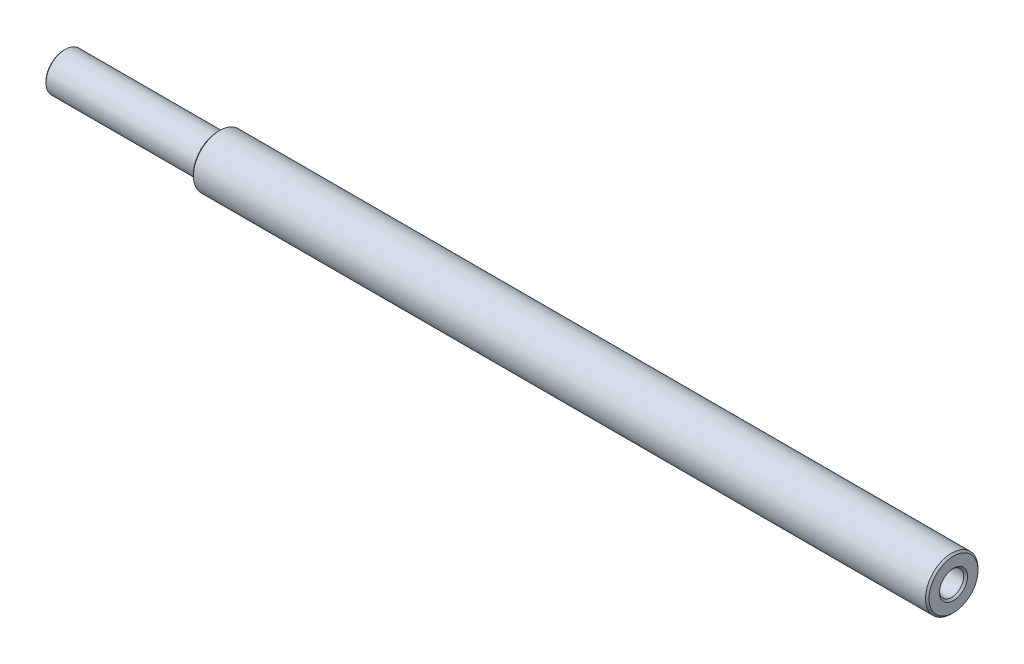
ISO-10303-21;
HEADER;
FILE_DESCRIPTION(('STEP AP214'),'2;1');
FILE_NAME('part.step','',(''),(''),'','','');
FILE_SCHEMA(('AUTOMOTIVE_DESIGN { 1 0 10303 214 1 1 1 1 }'));
ENDSEC;
DATA;
#1=APPLICATION_CONTEXT('core data for automotive mechanical design processes');
#2=APPLICATION_PROTOCOL_DEFINITION('international standard','automotive_design',2000,#1);
#3=PRODUCT_CONTEXT('',#1,'mechanical');
#4=PRODUCT('Part','Part','',(#3));
#5=PRODUCT_RELATED_PRODUCT_CATEGORY('part','',(#4));
#6=PRODUCT_DEFINITION_FORMATION('','',#4);
#7=PRODUCT_DEFINITION_CONTEXT('part definition',#1,'design');
#8=PRODUCT_DEFINITION('design','',#6,#7);
#9=PRODUCT_DEFINITION_SHAPE('','',#8);
#10=(LENGTH_UNIT() NAMED_UNIT(*) SI_UNIT(.MILLI.,.METRE.));
#11=(NAMED_UNIT(*) PLANE_ANGLE_UNIT() SI_UNIT($,.RADIAN.));
#12=(NAMED_UNIT(*) SI_UNIT($,.STERADIAN.) SOLID_ANGLE_UNIT());
#13=UNCERTAINTY_MEASURE_WITH_UNIT(LENGTH_MEASURE(1.E-05),#10,'distance_accuracy_value','');
#14=(GEOMETRIC_REPRESENTATION_CONTEXT(3) GLOBAL_UNCERTAINTY_ASSIGNED_CONTEXT((#13)) GLOBAL_UNIT_ASSIGNED_CONTEXT((#10,
#11,#12)) REPRESENTATION_CONTEXT('',''));
#15=CARTESIAN_POINT('',(0.,0.,0.));
#16=DIRECTION('',(0.,0.,1.));
#17=DIRECTION('',(1.,0.,0.));
#18=AXIS2_PLACEMENT_3D('',#15,#16,#17);
#19=CARTESIAN_POINT('',(-44.,-5.10000000000004,5.1000003918236));
#20=DIRECTION('',(-1.,0.,0.));
#21=DIRECTION('',(0.,1.,0.));
#22=AXIS2_PLACEMENT_3D('',#19,#20,#21);
#23=PLANE('',#22);
#24=CARTESIAN_POINT('',(-44.,0.,0.));
#25=DIRECTION('',(-1.,0.,0.));
#26=DIRECTION('',(0.,0.,-1.));
#27=AXIS2_PLACEMENT_3D('',#24,#25,#26);
#28=CIRCLE('',#27,5.1);
#29=CARTESIAN_POINT('',(-44.,0.,-5.1));
#30=VERTEX_POINT('',#29);
#31=EDGE_CURVE('E146',#30,#30,#28,.F.);
#32=ORIENTED_EDGE('',*,*,#31,.F.);
#33=EDGE_LOOP('',(#32));
#34=FACE_BOUND('',#33,.T.);
#35=CARTESIAN_POINT('',(-44.,0.,0.));
#36=DIRECTION('',(1.,0.,0.));
#37=DIRECTION('',(0.,0.,1.));
#38=AXIS2_PLACEMENT_3D('',#35,#36,#37);
#39=CIRCLE('',#38,3.);
#40=CARTESIAN_POINT('',(-44.,0.,3.));
#41=VERTEX_POINT('',#40);
#42=EDGE_CURVE('E143',#41,#41,#39,.T.);
#43=ORIENTED_EDGE('',*,*,#42,.T.);
#44=EDGE_LOOP('',(#43));
#45=FACE_BOUND('',#44,.T.);
#46=ADVANCED_FACE('F16',(#34,#45),#23,.T.);
#47=CARTESIAN_POINT('',(0.,-7.19126770361166,7.));
#48=DIRECTION('',(-1.,0.,0.));
#49=DIRECTION('',(0.,1.,0.));
#50=AXIS2_PLACEMENT_3D('',#47,#48,#49);
#51=PLANE('',#50);
#52=CARTESIAN_POINT('',(0.,0.,0.));
#53=DIRECTION('',(-1.,0.,0.));
#54=DIRECTION('',(0.,0.,-1.));
#55=AXIS2_PLACEMENT_3D('',#52,#53,#54);
#56=CIRCLE('',#55,7.);
#57=CARTESIAN_POINT('',(0.,0.,-7.));
#58=VERTEX_POINT('',#57);
#59=EDGE_CURVE('E140',#58,#58,#56,.F.);
#60=ORIENTED_EDGE('',*,*,#59,.F.);
#61=EDGE_LOOP('',(#60));
#62=FACE_BOUND('',#61,.T.);
#63=CARTESIAN_POINT('',(0.,0.,0.));
#64=DIRECTION('',(1.,0.,0.));
#65=DIRECTION('',(0.,0.,1.));
#66=AXIS2_PLACEMENT_3D('',#63,#64,#65);
#67=CIRCLE('',#66,5.8);
#68=CARTESIAN_POINT('',(0.,0.,5.8));
#69=VERTEX_POINT('',#68);
#70=EDGE_CURVE('E135',#69,#69,#67,.T.);
#71=ORIENTED_EDGE('',*,*,#70,.T.);
#72=EDGE_LOOP('',(#71));
#73=FACE_BOUND('',#72,.T.);
#74=ADVANCED_FACE('F49',(#62,#73),#51,.T.);
#75=CARTESIAN_POINT('',(210.,-7.19126770361165,-7.));
#76=DIRECTION('',(1.,0.,0.));
#77=DIRECTION('',(0.,1.,0.));
#78=AXIS2_PLACEMENT_3D('',#75,#76,#77);
#79=PLANE('',#78);
#80=CARTESIAN_POINT('',(210.,0.,0.));
#81=DIRECTION('',(1.,0.,0.));
#82=DIRECTION('',(0.,0.,1.));
#83=AXIS2_PLACEMENT_3D('',#80,#81,#82);
#84=CIRCLE('',#83,7.);
#85=CARTESIAN_POINT('',(210.,0.,7.));
#86=VERTEX_POINT('',#85);
#87=EDGE_CURVE('E131',#86,#86,#84,.T.);
#88=ORIENTED_EDGE('',*,*,#87,.T.);
#89=EDGE_LOOP('',(#88));
#90=FACE_BOUND('',#89,.T.);
#91=CARTESIAN_POINT('',(210.,0.,0.));
#92=DIRECTION('',(-1.,0.,0.));
#93=DIRECTION('',(0.,0.,-1.));
#94=AXIS2_PLACEMENT_3D('',#91,#92,#93);
#95=CIRCLE('',#94,4.00000000000001);
#96=CARTESIAN_POINT('',(210.,0.,-4.00000000000001));
#97=VERTEX_POINT('',#96);
#98=EDGE_CURVE('E126',#97,#97,#95,.F.);
#99=ORIENTED_EDGE('',*,*,#98,.F.);
#100=EDGE_LOOP('',(#99));
#101=FACE_BOUND('',#100,.T.);
#102=ADVANCED_FACE('F55',(#90,#101),#79,.T.);
#103=CARTESIAN_POINT('',(-43.6,0.,0.));
#104=DIRECTION('',(1.,0.,0.));
#105=DIRECTION('',(0.,1.42158509975128E-07,0.99999999999999));
#106=AXIS2_PLACEMENT_3D('',#103,#104,#105);
#107=CONICAL_SURFACE('',#106,5.49999999999999,0.785398163397434);
#108=CARTESIAN_POINT('',(-43.6,0.,0.));
#109=DIRECTION('',(-1.,0.,0.));
#110=DIRECTION('',(0.,0.,-1.));
#111=AXIS2_PLACEMENT_3D('',#108,#109,#110);
#112=CIRCLE('',#111,5.49999999999999);
#113=CARTESIAN_POINT('',(-43.6,0.,-5.49999999999999));
#114=VERTEX_POINT('',#113);
#115=EDGE_CURVE('E96',#114,#114,#112,.F.);
#116=ORIENTED_EDGE('',*,*,#115,.F.);
#117=EDGE_LOOP('',(#116));
#118=FACE_BOUND('',#117,.T.);
#119=ORIENTED_EDGE('',*,*,#31,.T.);
#120=EDGE_LOOP('',(#119));
#121=FACE_BOUND('',#120,.T.);
#122=ADVANCED_FACE('F63',(#118,#121),#107,.T.);
#123=CARTESIAN_POINT('',(210.,0.,0.));
#124=DIRECTION('',(1.,0.,0.));
#125=DIRECTION('',(0.,7.69288311171376E-10,1.));
#126=AXIS2_PLACEMENT_3D('',#123,#124,#125);
#127=CYLINDRICAL_SURFACE('',#126,5.5);
#128=CARTESIAN_POINT('',(-0.299999999999983,0.,0.));
#129=DIRECTION('',(-1.,0.,0.));
#130=DIRECTION('',(0.,0.,-1.));
#131=AXIS2_PLACEMENT_3D('',#128,#129,#130);
#132=CIRCLE('',#131,5.5);
#133=CARTESIAN_POINT('',(-0.299999999999983,0.,-5.5));
#134=VERTEX_POINT('',#133);
#135=EDGE_CURVE('E91',#134,#134,#132,.F.);
#136=ORIENTED_EDGE('',*,*,#135,.F.);
#137=EDGE_LOOP('',(#136));
#138=FACE_BOUND('',#137,.T.);
#139=ORIENTED_EDGE('',*,*,#115,.T.);
#140=EDGE_LOOP('',(#139));
#141=FACE_BOUND('',#140,.T.);
#142=ADVANCED_FACE('F67',(#138,#141),#127,.T.);
#143=CARTESIAN_POINT('',(-0.299999999999938,0.,0.));
#144=DIRECTION('',(1.,0.,0.));
#145=DIRECTION('',(0.,7.69405994811986E-10,1.));
#146=AXIS2_PLACEMENT_3D('',#143,#144,#145);
#147=TOROIDAL_SURFACE('',#146,5.8,0.299999999999938);
#148=ORIENTED_EDGE('',*,*,#70,.F.);
#149=EDGE_LOOP('',(#148));
#150=FACE_BOUND('',#149,.T.);
#151=ORIENTED_EDGE('',*,*,#135,.T.);
#152=EDGE_LOOP('',(#151));
#153=FACE_BOUND('',#152,.T.);
#154=ADVANCED_FACE('F71',(#150,#153),#147,.F.);
#155=CARTESIAN_POINT('',(0.500000000000001,0.,0.));
#156=DIRECTION('',(1.,0.,0.));
#157=DIRECTION('',(0.,1.92343152856519E-10,1.));
#158=AXIS2_PLACEMENT_3D('',#155,#156,#157);
#159=CONICAL_SURFACE('',#158,7.5,0.785398163397447);
#160=CARTESIAN_POINT('',(0.500000000000001,0.,0.));
#161=DIRECTION('',(-1.,0.,0.));
#162=DIRECTION('',(0.,0.,-1.));
#163=AXIS2_PLACEMENT_3D('',#160,#161,#162);
#164=CIRCLE('',#163,7.5);
#165=CARTESIAN_POINT('',(0.500000000000001,0.,-7.5));
#166=VERTEX_POINT('',#165);
#167=EDGE_CURVE('E90',#166,#166,#164,.F.);
#168=ORIENTED_EDGE('',*,*,#167,.F.);
#169=EDGE_LOOP('',(#168));
#170=FACE_BOUND('',#169,.T.);
#171=ORIENTED_EDGE('',*,*,#59,.T.);
#172=EDGE_LOOP('',(#171));
#173=FACE_BOUND('',#172,.T.);
#174=ADVANCED_FACE('F75',(#170,#173),#159,.T.);
#175=CARTESIAN_POINT('',(210.,0.,0.));
#176=DIRECTION('',(1.,0.,0.));
#177=DIRECTION('',(0.,7.69370911764408E-10,1.));
#178=AXIS2_PLACEMENT_3D('',#175,#176,#177);
#179=CYLINDRICAL_SURFACE('',#178,7.5);
#180=CARTESIAN_POINT('',(209.5,0.,0.));
#181=DIRECTION('',(-1.,0.,0.));
#182=DIRECTION('',(0.,0.,-1.));
#183=AXIS2_PLACEMENT_3D('',#180,#181,#182);
#184=CIRCLE('',#183,7.5);
#185=CARTESIAN_POINT('',(209.5,0.,-7.5));
#186=VERTEX_POINT('',#185);
#187=EDGE_CURVE('E87',#186,#186,#184,.F.);
#188=ORIENTED_EDGE('',*,*,#187,.F.);
#189=EDGE_LOOP('',(#188));
#190=FACE_BOUND('',#189,.T.);
#191=ORIENTED_EDGE('',*,*,#167,.T.);
#192=EDGE_LOOP('',(#191));
#193=FACE_BOUND('',#192,.T.);
#194=ADVANCED_FACE('F44',(#190,#193),#179,.T.);
#195=CARTESIAN_POINT('',(209.5,0.,0.));
#196=DIRECTION('',(-1.,0.,0.));
#197=DIRECTION('',(0.,0.,-1.));
#198=AXIS2_PLACEMENT_3D('',#195,#196,#197);
#199=CONICAL_SURFACE('',#198,7.5,0.785398163397447);
#200=ORIENTED_EDGE('',*,*,#87,.F.);
#201=EDGE_LOOP('',(#200));
#202=FACE_BOUND('',#201,.T.);
#203=ORIENTED_EDGE('',*,*,#187,.T.);
#204=EDGE_LOOP('',(#203));
#205=FACE_BOUND('',#204,.T.);
#206=ADVANCED_FACE('F33',(#202,#205),#199,.T.);
#207=CARTESIAN_POINT('',(187.99676590599,0.,0.));
#208=DIRECTION('',(1.,0.,0.));
#209=DIRECTION('',(0.,0.,1.));
#210=AXIS2_PLACEMENT_3D('',#207,#208,#209);
#211=CONICAL_SURFACE('',#210,3.45849999999998,1.0471975511971);
#212=CARTESIAN_POINT('',(187.99676590599,0.,0.));
#213=DIRECTION('',(1.,0.,0.));
#214=DIRECTION('',(0.,0.,1.));
#215=AXIS2_PLACEMENT_3D('',#212,#213,#214);
#216=CIRCLE('',#215,3.45849999999998);
#217=CARTESIAN_POINT('',(187.99676590599,0.,3.45849999999998));
#218=VERTEX_POINT('',#217);
#219=EDGE_CURVE('E93',#218,#218,#216,.T.);
#220=ORIENTED_EDGE('',*,*,#219,.T.);
#221=EDGE_LOOP('',(#220));
#222=FACE_BOUND('',#221,.T.);
#223=CARTESIAN_POINT('',(186.,0.,0.));
#224=VERTEX_POINT('',#223);
#225=VERTEX_LOOP('',#224);
#226=FACE_BOUND('',#225,.T.);
#227=ADVANCED_FACE('F30',(#222,#226),#211,.F.);
#228=CARTESIAN_POINT('',(210.,0.,0.));
#229=DIRECTION('',(1.,0.,0.));
#230=DIRECTION('',(0.,0.,1.));
#231=AXIS2_PLACEMENT_3D('',#228,#229,#230);
#232=CYLINDRICAL_SURFACE('',#231,3.4585);
#233=CARTESIAN_POINT('',(209.4585,0.,0.));
#234=DIRECTION('',(1.,0.,0.));
#235=DIRECTION('',(0.,-1.92329141161654E-10,1.));
#236=AXIS2_PLACEMENT_3D('',#233,#234,#235);
#237=CIRCLE('',#236,3.4585);
#238=CARTESIAN_POINT('',(209.4585,-6.65170334707581E-10,3.4585));
#239=VERTEX_POINT('',#238);
#240=EDGE_CURVE('E101',#239,#239,#237,.T.);
#241=ORIENTED_EDGE('',*,*,#240,.T.);
#242=EDGE_LOOP('',(#241));
#243=FACE_BOUND('',#242,.T.);
#244=ORIENTED_EDGE('',*,*,#219,.F.);
#245=EDGE_LOOP('',(#244));
#246=FACE_BOUND('',#245,.T.);
#247=ADVANCED_FACE('F32',(#243,#246),#232,.F.);
#248=CARTESIAN_POINT('',(210.,0.,0.));
#249=DIRECTION('',(1.,0.,0.));
#250=DIRECTION('',(0.,0.,1.));
#251=AXIS2_PLACEMENT_3D('',#248,#249,#250);
#252=CONICAL_SURFACE('',#251,4.00000000000001,0.785398163397447);
#253=ORIENTED_EDGE('',*,*,#98,.T.);
#254=EDGE_LOOP('',(#253));
#255=FACE_BOUND('',#254,.T.);
#256=ORIENTED_EDGE('',*,*,#240,.F.);
#257=EDGE_LOOP('',(#256));
#258=FACE_BOUND('',#257,.T.);
#259=ADVANCED_FACE('F41',(#255,#258),#252,.F.);
#260=CARTESIAN_POINT('',(-44.,0.,0.));
#261=DIRECTION('',(-1.,0.,0.));
#262=DIRECTION('',(0.,0.,-1.));
#263=AXIS2_PLACEMENT_3D('',#260,#261,#262);
#264=CONICAL_SURFACE('',#263,3.,0.785398163397454);
#265=ORIENTED_EDGE('',*,*,#42,.F.);
#266=EDGE_LOOP('',(#265));
#267=FACE_BOUND('',#266,.T.);
#268=CARTESIAN_POINT('',(-43.4585,0.,0.));
#269=DIRECTION('',(1.,0.,0.));
#270=DIRECTION('',(0.,0.,1.));
#271=AXIS2_PLACEMENT_3D('',#268,#269,#270);
#272=CIRCLE('',#271,2.45849999999999);
#273=CARTESIAN_POINT('',(-43.4585,0.,2.45849999999999));
#274=VERTEX_POINT('',#273);
#275=EDGE_CURVE('E24',#274,#274,#272,.T.);
#276=ORIENTED_EDGE('',*,*,#275,.T.);
#277=EDGE_LOOP('',(#276));
#278=FACE_BOUND('',#277,.T.);
#279=ADVANCED_FACE('F106',(#267,#278),#264,.F.);
#280=CARTESIAN_POINT('',(-25.,0.,0.));
#281=DIRECTION('',(1.,0.,0.));
#282=DIRECTION('',(0.,0.,1.));
#283=AXIS2_PLACEMENT_3D('',#280,#281,#282);
#284=CYLINDRICAL_SURFACE('',#283,2.4585);
#285=CARTESIAN_POINT('',(-26.419415636803,0.,0.));
#286=DIRECTION('',(1.,0.,0.));
#287=DIRECTION('',(0.,0.,1.));
#288=AXIS2_PLACEMENT_3D('',#285,#286,#287);
#289=CIRCLE('',#288,2.4585);
#290=CARTESIAN_POINT('',(-26.419415636803,0.,2.4585));
#291=VERTEX_POINT('',#290);
#292=EDGE_CURVE('E11',#291,#291,#289,.T.);
#293=ORIENTED_EDGE('',*,*,#292,.T.);
#294=EDGE_LOOP('',(#293));
#295=FACE_BOUND('',#294,.T.);
#296=ORIENTED_EDGE('',*,*,#275,.F.);
#297=EDGE_LOOP('',(#296));
#298=FACE_BOUND('',#297,.T.);
#299=ADVANCED_FACE('F108',(#295,#298),#284,.F.);
#300=CARTESIAN_POINT('',(-26.419415636803,0.,0.));
#301=DIRECTION('',(-1.,0.,0.));
#302=DIRECTION('',(0.,0.,-1.));
#303=AXIS2_PLACEMENT_3D('',#300,#301,#302);
#304=CONICAL_SURFACE('',#303,2.4585,1.0471975511965);
#305=ORIENTED_EDGE('',*,*,#292,.F.);
#306=EDGE_LOOP('',(#305));
#307=FACE_BOUND('',#306,.T.);
#308=CARTESIAN_POINT('',(-25.,0.,0.));
#309=VERTEX_POINT('',#308);
#310=VERTEX_LOOP('',#309);
#311=FACE_BOUND('',#310,.T.);
#312=ADVANCED_FACE('F18',(#307,#311),#304,.F.);
#313=CLOSED_SHELL('',(#46,#74,#102,#122,#142,#154,#174,#194,#206,#227,#247,#259,#279,#299,#312));
#314=MANIFOLD_SOLID_BREP('B1',#313);
#315=ADVANCED_BREP_SHAPE_REPRESENTATION('',(#18,#314),#14);
#316=SHAPE_DEFINITION_REPRESENTATION(#9,#315);
ENDSEC;
END-ISO-10303-21;
